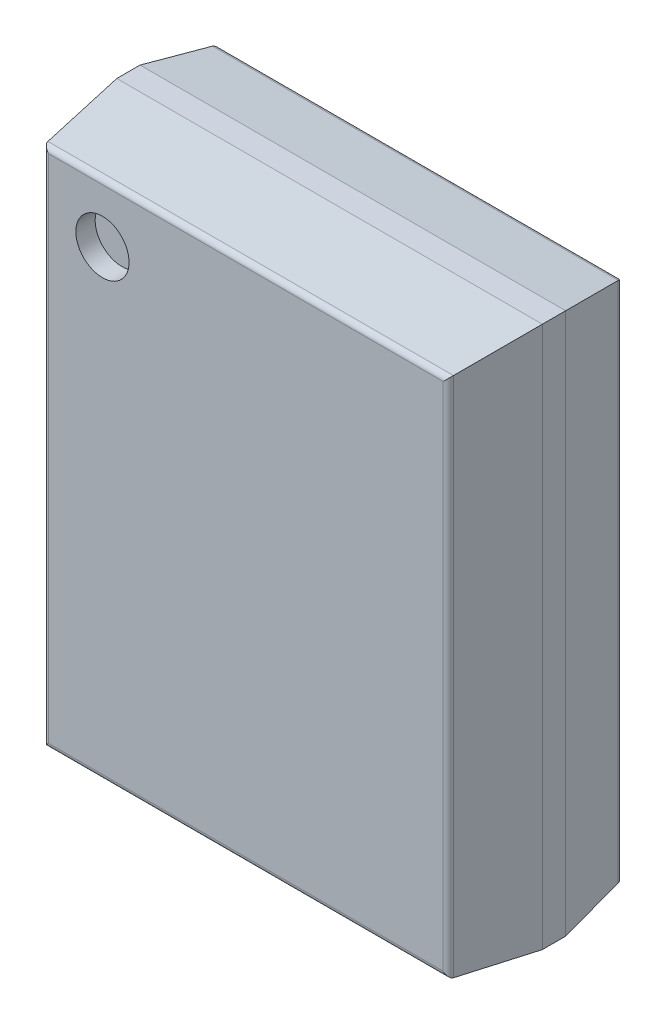
ISO-10303-21;
HEADER;
FILE_DESCRIPTION(('STEP AP214'),'2;1');
FILE_NAME('part.step','',(''),(''),'','','');
FILE_SCHEMA(('AUTOMOTIVE_DESIGN { 1 0 10303 214 1 1 1 1 }'));
ENDSEC;
DATA;
#1=APPLICATION_CONTEXT('core data for automotive mechanical design processes');
#2=APPLICATION_PROTOCOL_DEFINITION('international standard','automotive_design',2000,#1);
#3=PRODUCT_CONTEXT('',#1,'mechanical');
#4=PRODUCT('Part','Part','',(#3));
#5=PRODUCT_RELATED_PRODUCT_CATEGORY('part','',(#4));
#6=PRODUCT_DEFINITION_FORMATION('','',#4);
#7=PRODUCT_DEFINITION_CONTEXT('part definition',#1,'design');
#8=PRODUCT_DEFINITION('design','',#6,#7);
#9=PRODUCT_DEFINITION_SHAPE('','',#8);
#10=(LENGTH_UNIT() NAMED_UNIT(*) SI_UNIT(.MILLI.,.METRE.));
#11=(NAMED_UNIT(*) PLANE_ANGLE_UNIT() SI_UNIT($,.RADIAN.));
#12=(NAMED_UNIT(*) SI_UNIT($,.STERADIAN.) SOLID_ANGLE_UNIT());
#13=UNCERTAINTY_MEASURE_WITH_UNIT(LENGTH_MEASURE(1.E-05),#10,'distance_accuracy_value','');
#14=(GEOMETRIC_REPRESENTATION_CONTEXT(3) GLOBAL_UNCERTAINTY_ASSIGNED_CONTEXT((#13)) GLOBAL_UNIT_ASSIGNED_CONTEXT((#10,
#11,#12)) REPRESENTATION_CONTEXT('',''));
#15=CARTESIAN_POINT('',(0.,0.,0.));
#16=DIRECTION('',(0.,0.,1.));
#17=DIRECTION('',(1.,0.,0.));
#18=AXIS2_PLACEMENT_3D('',#15,#16,#17);
#19=CARTESIAN_POINT('',(-1.2975,1.8225,1.575));
#20=DIRECTION('',(0.,0.,1.));
#21=DIRECTION('',(1.,0.,0.));
#22=AXIS2_PLACEMENT_3D('',#19,#20,#21);
#23=PLANE('',#22);
#24=CARTESIAN_POINT('',(-1.2975,1.8225,1.575));
#25=DIRECTION('',(0.,0.,1.));
#26=DIRECTION('',(1.,0.,0.));
#27=AXIS2_PLACEMENT_3D('',#24,#25,#26);
#28=CIRCLE('',#27,0.240625);
#29=CARTESIAN_POINT('',(-1.056875,1.8225,1.575));
#30=VERTEX_POINT('',#29);
#31=EDGE_CURVE('E11',#30,#30,#28,.T.);
#32=ORIENTED_EDGE('',*,*,#31,.T.);
#33=EDGE_LOOP('',(#32));
#34=FACE_BOUND('',#33,.T.);
#35=ADVANCED_FACE('F17',(#34),#23,.T.);
#36=CARTESIAN_POINT('',(-1.2975,1.8225,1.575));
#37=DIRECTION('',(0.,0.,1.));
#38=DIRECTION('',(1.,0.,0.));
#39=AXIS2_PLACEMENT_3D('',#36,#37,#38);
#40=CYLINDRICAL_SURFACE('',#39,0.240625);
#41=DIRECTION('',(0.,0.,1.));
#42=VECTOR('',#41,1.);
#43=CARTESIAN_POINT('',(-1.056875,1.8225,1.575));
#44=LINE('',#43,#42);
#45=CARTESIAN_POINT('',(-1.056875,1.8225,1.75));
#46=VERTEX_POINT('',#45);
#47=EDGE_CURVE('E20',#30,#46,#44,.T.);
#48=ORIENTED_EDGE('',*,*,#47,.T.);
#49=CARTESIAN_POINT('',(-1.2975,1.8225,1.75));
#50=DIRECTION('',(0.,0.,1.));
#51=DIRECTION('',(1.,0.,0.));
#52=AXIS2_PLACEMENT_3D('',#49,#50,#51);
#53=CIRCLE('',#52,0.240625);
#54=EDGE_CURVE('E297',#46,#46,#53,.T.);
#55=ORIENTED_EDGE('',*,*,#54,.T.);
#56=ORIENTED_EDGE('',*,*,#47,.F.);
#57=ORIENTED_EDGE('',*,*,#31,.F.);
#58=EDGE_LOOP('',(#48,#55,#56,#57));
#59=FACE_BOUND('',#58,.T.);
#60=ADVANCED_FACE('F522',(#59),#40,.F.);
#61=CARTESIAN_POINT('',(1.78470292559,-2.35375,1.7));
#62=DIRECTION('',(0.,1.,0.));
#63=DIRECTION('',(0.,0.,1.));
#64=AXIS2_PLACEMENT_3D('',#61,#62,#63);
#65=CYLINDRICAL_SURFACE('',#64,0.05);
#66=CARTESIAN_POINT('',(1.78470292559,-2.30970292559,1.7));
#67=DIRECTION('',(-0.707106781186548,-0.707106781186548,0.));
#68=DIRECTION('',(0.707106781186548,-0.707106781186548,0.));
#69=AXIS2_PLACEMENT_3D('',#66,#67,#68);
#70=ELLIPSE('',#69,0.07071067811865,0.05);
#71=CARTESIAN_POINT('',(1.834303869648,-2.359303869648,1.706304470526));
#72=VERTEX_POINT('',#71);
#73=CARTESIAN_POINT('',(1.78470292559,-2.30970292559,1.75));
#74=VERTEX_POINT('',#73);
#75=EDGE_CURVE('E281',#72,#74,#70,.T.);
#76=ORIENTED_EDGE('',*,*,#75,.F.);
#77=DIRECTION('',(0.,1.,0.));
#78=VECTOR('',#77,1.);
#79=CARTESIAN_POINT('',(1.834303869648,-2.35375,1.706304470526));
#80=LINE('',#79,#78);
#81=CARTESIAN_POINT('',(1.834303869648,2.359303869648,1.706304470526));
#82=VERTEX_POINT('',#81);
#83=EDGE_CURVE('E277',#72,#82,#80,.T.);
#84=ORIENTED_EDGE('',*,*,#83,.T.);
#85=CARTESIAN_POINT('',(1.78470292559,2.30970292559,1.7));
#86=DIRECTION('',(-0.707106781186548,0.707106781186548,0.));
#87=DIRECTION('',(0.707106781186548,0.707106781186548,0.));
#88=AXIS2_PLACEMENT_3D('',#85,#86,#87);
#89=ELLIPSE('',#88,0.07071067811865,0.05);
#90=CARTESIAN_POINT('',(1.78470292559,2.30970292559,1.75));
#91=VERTEX_POINT('',#90);
#92=EDGE_CURVE('E299',#91,#82,#89,.T.);
#93=ORIENTED_EDGE('',*,*,#92,.F.);
#94=DIRECTION('',(0.,1.,0.));
#95=VECTOR('',#94,1.);
#96=CARTESIAN_POINT('',(1.78470292559,-2.35375,1.75));
#97=LINE('',#96,#95);
#98=EDGE_CURVE('E289',#74,#91,#97,.T.);
#99=ORIENTED_EDGE('',*,*,#98,.F.);
#100=EDGE_LOOP('',(#76,#84,#93,#99));
#101=FACE_BOUND('',#100,.T.);
#102=ADVANCED_FACE('F513',(#101),#65,.T.);
#103=CARTESIAN_POINT('',(-1.82875,2.30970292559,1.7));
#104=DIRECTION('',(1.,0.,0.));
#105=DIRECTION('',(0.,0.,1.));
#106=AXIS2_PLACEMENT_3D('',#103,#104,#105);
#107=CYLINDRICAL_SURFACE('',#106,0.05);
#108=DIRECTION('',(1.,0.,0.));
#109=VECTOR('',#108,1.);
#110=CARTESIAN_POINT('',(-1.82875,2.30970292559,1.75));
#111=LINE('',#110,#109);
#112=CARTESIAN_POINT('',(-1.78470292559,2.30970292559,1.75));
#113=VERTEX_POINT('',#112);
#114=EDGE_CURVE('E293',#113,#91,#111,.T.);
#115=ORIENTED_EDGE('',*,*,#114,.T.);
#116=ORIENTED_EDGE('',*,*,#92,.T.);
#117=DIRECTION('',(1.,0.,0.));
#118=VECTOR('',#117,1.);
#119=CARTESIAN_POINT('',(-1.82875,2.359303869648,1.706304470526));
#120=LINE('',#119,#118);
#121=CARTESIAN_POINT('',(-1.834303869648,2.359303869648,1.706304470526));
#122=VERTEX_POINT('',#121);
#123=EDGE_CURVE('E192',#122,#82,#120,.T.);
#124=ORIENTED_EDGE('',*,*,#123,.F.);
#125=CARTESIAN_POINT('',(-1.78470292559,2.30970292559,1.7));
#126=DIRECTION('',(0.707106781186548,0.707106781186548,0.));
#127=DIRECTION('',(-0.707106781186548,0.707106781186548,0.));
#128=AXIS2_PLACEMENT_3D('',#125,#126,#127);
#129=ELLIPSE('',#128,0.07071067811865,0.05);
#130=EDGE_CURVE('E271',#122,#113,#129,.T.);
#131=ORIENTED_EDGE('',*,*,#130,.T.);
#132=EDGE_LOOP('',(#115,#116,#124,#131));
#133=FACE_BOUND('',#132,.T.);
#134=ADVANCED_FACE('F503',(#133),#107,.T.);
#135=CARTESIAN_POINT('',(-1.925,-2.45,1.75));
#136=DIRECTION('',(0.,0.,1.));
#137=DIRECTION('',(1.,0.,0.));
#138=AXIS2_PLACEMENT_3D('',#135,#136,#137);
#139=PLANE('',#138);
#140=ORIENTED_EDGE('',*,*,#54,.F.);
#141=EDGE_LOOP('',(#140));
#142=FACE_BOUND('',#141,.T.);
#143=DIRECTION('',(0.,1.,0.));
#144=VECTOR('',#143,1.);
#145=CARTESIAN_POINT('',(-1.78470292559,-2.35375,1.75));
#146=LINE('',#145,#144);
#147=CARTESIAN_POINT('',(-1.78470292559,-2.30970292559,1.75));
#148=VERTEX_POINT('',#147);
#149=EDGE_CURVE('E267',#148,#113,#146,.T.);
#150=ORIENTED_EDGE('',*,*,#149,.F.);
#151=DIRECTION('',(1.,0.,0.));
#152=VECTOR('',#151,1.);
#153=CARTESIAN_POINT('',(-1.82875,-2.30970292559,1.75));
#154=LINE('',#153,#152);
#155=EDGE_CURVE('E285',#148,#74,#154,.T.);
#156=ORIENTED_EDGE('',*,*,#155,.T.);
#157=ORIENTED_EDGE('',*,*,#98,.T.);
#158=ORIENTED_EDGE('',*,*,#114,.F.);
#159=EDGE_LOOP('',(#150,#156,#157,#158));
#160=FACE_BOUND('',#159,.T.);
#161=ADVANCED_FACE('F493',(#142,#160),#139,.T.);
#162=CARTESIAN_POINT('',(-1.82875,-2.30970292559,1.7));
#163=DIRECTION('',(1.,0.,0.));
#164=DIRECTION('',(0.,-0.992018881147276,0.126089410528035));
#165=AXIS2_PLACEMENT_3D('',#162,#163,#164);
#166=CYLINDRICAL_SURFACE('',#165,0.05);
#167=DIRECTION('',(1.,0.,0.));
#168=VECTOR('',#167,1.);
#169=CARTESIAN_POINT('',(-1.82875,-2.359303869648,1.706304470526));
#170=LINE('',#169,#168);
#171=CARTESIAN_POINT('',(-1.834303869648,-2.359303869648,1.706304470526));
#172=VERTEX_POINT('',#171);
#173=EDGE_CURVE('E216',#172,#72,#170,.T.);
#174=ORIENTED_EDGE('',*,*,#173,.T.);
#175=ORIENTED_EDGE('',*,*,#75,.T.);
#176=ORIENTED_EDGE('',*,*,#155,.F.);
#177=CARTESIAN_POINT('',(-1.78470292559,-2.30970292559,1.7));
#178=DIRECTION('',(-0.707106781186548,0.707106781186548,0.));
#179=DIRECTION('',(0.707106781186548,0.707106781186548,0.));
#180=AXIS2_PLACEMENT_3D('',#177,#178,#179);
#181=ELLIPSE('',#180,0.07071067811865,0.05);
#182=EDGE_CURVE('E220',#172,#148,#181,.T.);
#183=ORIENTED_EDGE('',*,*,#182,.F.);
#184=EDGE_LOOP('',(#174,#175,#176,#183));
#185=FACE_BOUND('',#184,.T.);
#186=ADVANCED_FACE('F484',(#185),#166,.T.);
#187=CARTESIAN_POINT('',(1.876875,-2.45,1.37137257637));
#188=DIRECTION('',(0.992018881147276,0.,0.126089410528035));
#189=DIRECTION('',(0.,-1.,0.));
#190=AXIS2_PLACEMENT_3D('',#187,#188,#189);
#191=PLANE('',#190);
#192=DIRECTION('',(-0.125098887175002,0.125098887175002,0.984225856628016));
#193=VECTOR('',#192,1.);
#194=CARTESIAN_POINT('',(1.847502410055,-2.372502410055,1.602463860656));
#195=LINE('',#194,#193);
#196=CARTESIAN_POINT('',(1.925,-2.45,0.992745152739));
#197=VERTEX_POINT('',#196);
#198=EDGE_CURVE('E221',#197,#72,#195,.T.);
#199=ORIENTED_EDGE('',*,*,#198,.F.);
#200=DIRECTION('',(0.,1.,0.));
#201=VECTOR('',#200,1.);
#202=CARTESIAN_POINT('',(1.925,-2.45,0.992745152739));
#203=LINE('',#202,#201);
#204=CARTESIAN_POINT('',(1.925,2.45,0.992745152739));
#205=VERTEX_POINT('',#204);
#206=EDGE_CURVE('E154',#197,#205,#203,.T.);
#207=ORIENTED_EDGE('',*,*,#206,.T.);
#208=DIRECTION('',(-0.125098887175002,-0.125098887175002,0.984225856628016));
#209=VECTOR('',#208,1.);
#210=CARTESIAN_POINT('',(1.809160567702,2.334160567702,1.90412148117));
#211=LINE('',#210,#209);
#212=EDGE_CURVE('E148',#205,#82,#211,.T.);
#213=ORIENTED_EDGE('',*,*,#212,.T.);
#214=ORIENTED_EDGE('',*,*,#83,.F.);
#215=EDGE_LOOP('',(#199,#207,#213,#214));
#216=FACE_BOUND('',#215,.T.);
#217=ADVANCED_FACE('F475',(#216),#191,.T.);
#218=CARTESIAN_POINT('',(-1.925,2.401875,1.37137257637));
#219=DIRECTION('',(0.,0.992018881147276,0.126089410528035));
#220=DIRECTION('',(1.,0.,0.));
#221=AXIS2_PLACEMENT_3D('',#218,#219,#220);
#222=PLANE('',#221);
#223=ORIENTED_EDGE('',*,*,#123,.T.);
#224=ORIENTED_EDGE('',*,*,#212,.F.);
#225=DIRECTION('',(1.,0.,0.));
#226=VECTOR('',#225,1.);
#227=CARTESIAN_POINT('',(-1.925,2.45,0.992745152739));
#228=LINE('',#227,#226);
#229=CARTESIAN_POINT('',(-1.925,2.45,0.992745152739));
#230=VERTEX_POINT('',#229);
#231=EDGE_CURVE('E141',#230,#205,#228,.T.);
#232=ORIENTED_EDGE('',*,*,#231,.F.);
#233=DIRECTION('',(0.125098887175002,-0.125098887175002,0.984225856628016));
#234=VECTOR('',#233,1.);
#235=CARTESIAN_POINT('',(-1.839286300979,2.364286300979,1.667104779337));
#236=LINE('',#235,#234);
#237=EDGE_CURVE('E145',#230,#122,#236,.T.);
#238=ORIENTED_EDGE('',*,*,#237,.T.);
#239=EDGE_LOOP('',(#223,#224,#232,#238));
#240=FACE_BOUND('',#239,.T.);
#241=ADVANCED_FACE('F144',(#240),#222,.T.);
#242=CARTESIAN_POINT('',(-1.78470292559,-2.35375,1.7));
#243=DIRECTION('',(0.,1.,0.));
#244=DIRECTION('',(-0.992018881147276,0.,0.126089410528035));
#245=AXIS2_PLACEMENT_3D('',#242,#243,#244);
#246=CYLINDRICAL_SURFACE('',#245,0.05);
#247=ORIENTED_EDGE('',*,*,#182,.T.);
#248=ORIENTED_EDGE('',*,*,#149,.T.);
#249=ORIENTED_EDGE('',*,*,#130,.F.);
#250=DIRECTION('',(0.,1.,0.));
#251=VECTOR('',#250,1.);
#252=CARTESIAN_POINT('',(-1.834303869648,-2.35375,1.706304470526));
#253=LINE('',#252,#251);
#254=EDGE_CURVE('E164',#172,#122,#253,.T.);
#255=ORIENTED_EDGE('',*,*,#254,.F.);
#256=EDGE_LOOP('',(#247,#248,#249,#255));
#257=FACE_BOUND('',#256,.T.);
#258=ADVANCED_FACE('F458',(#257),#246,.T.);
#259=CARTESIAN_POINT('',(-1.925,-2.401875,1.37137257637));
#260=DIRECTION('',(0.,0.992018881147276,-0.126089410528035));
#261=DIRECTION('',(-1.,0.,0.));
#262=AXIS2_PLACEMENT_3D('',#259,#260,#261);
#263=PLANE('',#262);
#264=DIRECTION('',(0.125098887175002,0.125098887175002,0.984225856628016));
#265=VECTOR('',#264,1.);
#266=CARTESIAN_POINT('',(-1.877628143332,-2.402628143332,1.365447158824));
#267=LINE('',#266,#265);
#268=CARTESIAN_POINT('',(-1.925,-2.45,0.992745152739));
#269=VERTEX_POINT('',#268);
#270=EDGE_CURVE('E166',#269,#172,#267,.T.);
#271=ORIENTED_EDGE('',*,*,#270,.F.);
#272=DIRECTION('',(1.,0.,0.));
#273=VECTOR('',#272,1.);
#274=CARTESIAN_POINT('',(-1.925,-2.45,0.992745152739));
#275=LINE('',#274,#273);
#276=EDGE_CURVE('E240',#269,#197,#275,.T.);
#277=ORIENTED_EDGE('',*,*,#276,.T.);
#278=ORIENTED_EDGE('',*,*,#198,.T.);
#279=ORIENTED_EDGE('',*,*,#173,.F.);
#280=EDGE_LOOP('',(#271,#277,#278,#279));
#281=FACE_BOUND('',#280,.T.);
#282=ADVANCED_FACE('F448',(#281),#263,.F.);
#283=CARTESIAN_POINT('',(1.925,-2.45,0.175));
#284=DIRECTION('',(1.,0.,0.));
#285=DIRECTION('',(0.,1.,0.));
#286=AXIS2_PLACEMENT_3D('',#283,#284,#285);
#287=PLANE('',#286);
#288=DIRECTION('',(0.,0.,1.));
#289=VECTOR('',#288,1.);
#290=CARTESIAN_POINT('',(1.925,-2.45,0.175));
#291=LINE('',#290,#289);
#292=CARTESIAN_POINT('',(1.925,-2.45,0.782745152739));
#293=VERTEX_POINT('',#292);
#294=EDGE_CURVE('E232',#293,#197,#291,.T.);
#295=ORIENTED_EDGE('',*,*,#294,.F.);
#296=DIRECTION('',(0.,1.,0.));
#297=VECTOR('',#296,1.);
#298=CARTESIAN_POINT('',(1.925,-2.45,0.782745152739));
#299=LINE('',#298,#297);
#300=CARTESIAN_POINT('',(1.925,2.45,0.782745152739));
#301=VERTEX_POINT('',#300);
#302=EDGE_CURVE('E231',#293,#301,#299,.T.);
#303=ORIENTED_EDGE('',*,*,#302,.T.);
#304=DIRECTION('',(0.,0.,1.));
#305=VECTOR('',#304,1.);
#306=CARTESIAN_POINT('',(1.925,2.45,0.175));
#307=LINE('',#306,#305);
#308=EDGE_CURVE('E155',#301,#205,#307,.T.);
#309=ORIENTED_EDGE('',*,*,#308,.T.);
#310=ORIENTED_EDGE('',*,*,#206,.F.);
#311=EDGE_LOOP('',(#295,#303,#309,#310));
#312=FACE_BOUND('',#311,.T.);
#313=ADVANCED_FACE('F438',(#312),#287,.T.);
#314=CARTESIAN_POINT('',(1.786045453828,-2.35375,0.225));
#315=DIRECTION('',(0.,1.,0.));
#316=DIRECTION('',(0.,0.,-1.));
#317=AXIS2_PLACEMENT_3D('',#314,#315,#316);
#318=CYLINDRICAL_SURFACE('',#317,0.05);
#319=DIRECTION('',(0.,1.,0.));
#320=VECTOR('',#319,1.);
#321=CARTESIAN_POINT('',(1.786045453828,-2.35375,0.175));
#322=LINE('',#321,#320);
#323=CARTESIAN_POINT('',(1.786045453828,-2.311045453828,0.175));
#324=VERTEX_POINT('',#323);
#325=CARTESIAN_POINT('',(1.786045453828,2.311045453828,0.175));
#326=VERTEX_POINT('',#325);
#327=EDGE_CURVE('E251',#324,#326,#322,.T.);
#328=ORIENTED_EDGE('',*,*,#327,.T.);
#329=CARTESIAN_POINT('',(1.786045453828,2.311045453828,0.225));
#330=DIRECTION('',(0.707106781186548,-0.707106781186548,0.));
#331=DIRECTION('',(0.707106781186548,0.707106781186548,0.));
#332=AXIS2_PLACEMENT_3D('',#329,#330,#331);
#333=ELLIPSE('',#332,0.07071067811865,0.05);
#334=CARTESIAN_POINT('',(1.83542996346,2.36042996346,0.217178861435));
#335=VERTEX_POINT('',#334);
#336=EDGE_CURVE('E255',#326,#335,#333,.T.);
#337=ORIENTED_EDGE('',*,*,#336,.T.);
#338=DIRECTION('',(0.,1.,0.));
#339=VECTOR('',#338,1.);
#340=CARTESIAN_POINT('',(1.83542996346,-2.35375,0.217178861435));
#341=LINE('',#340,#339);
#342=CARTESIAN_POINT('',(1.83542996346,-2.36042996346,0.217178861435));
#343=VERTEX_POINT('',#342);
#344=EDGE_CURVE('E227',#343,#335,#341,.T.);
#345=ORIENTED_EDGE('',*,*,#344,.F.);
#346=CARTESIAN_POINT('',(1.786045453828,-2.311045453828,0.225));
#347=DIRECTION('',(0.707106781186548,0.707106781186548,0.));
#348=DIRECTION('',(0.707106781186548,-0.707106781186548,0.));
#349=AXIS2_PLACEMENT_3D('',#346,#347,#348);
#350=ELLIPSE('',#349,0.07071067811865,0.05);
#351=EDGE_CURVE('E236',#343,#324,#350,.T.);
#352=ORIENTED_EDGE('',*,*,#351,.T.);
#353=EDGE_LOOP('',(#328,#337,#345,#352));
#354=FACE_BOUND('',#353,.T.);
#355=ADVANCED_FACE('F429',(#354),#318,.T.);
#356=CARTESIAN_POINT('',(-1.925,2.45,0.175));
#357=DIRECTION('',(0.,1.,0.));
#358=DIRECTION('',(1.,0.,0.));
#359=AXIS2_PLACEMENT_3D('',#356,#357,#358);
#360=PLANE('',#359);
#361=ORIENTED_EDGE('',*,*,#308,.F.);
#362=DIRECTION('',(1.,0.,0.));
#363=VECTOR('',#362,1.);
#364=CARTESIAN_POINT('',(-1.925,2.45,0.782745152739));
#365=LINE('',#364,#363);
#366=CARTESIAN_POINT('',(-1.925,2.45,0.782745152739));
#367=VERTEX_POINT('',#366);
#368=EDGE_CURVE('E172',#367,#301,#365,.T.);
#369=ORIENTED_EDGE('',*,*,#368,.F.);
#370=DIRECTION('',(0.,0.,1.));
#371=VECTOR('',#370,1.);
#372=CARTESIAN_POINT('',(-1.925,2.45,0.175));
#373=LINE('',#372,#371);
#374=EDGE_CURVE('E169',#367,#230,#373,.T.);
#375=ORIENTED_EDGE('',*,*,#374,.T.);
#376=ORIENTED_EDGE('',*,*,#231,.T.);
#377=EDGE_LOOP('',(#361,#369,#375,#376));
#378=FACE_BOUND('',#377,.T.);
#379=ADVANCED_FACE('F170',(#378),#360,.T.);
#380=CARTESIAN_POINT('',(-1.876875,-2.45,1.37137257637));
#381=DIRECTION('',(0.992018881147276,0.,-0.126089410528035));
#382=DIRECTION('',(0.,-1.,0.));
#383=AXIS2_PLACEMENT_3D('',#380,#381,#382);
#384=PLANE('',#383);
#385=ORIENTED_EDGE('',*,*,#254,.T.);
#386=ORIENTED_EDGE('',*,*,#237,.F.);
#387=DIRECTION('',(0.,1.,0.));
#388=VECTOR('',#387,1.);
#389=CARTESIAN_POINT('',(-1.925,-2.45,0.992745152739));
#390=LINE('',#389,#388);
#391=EDGE_CURVE('E162',#269,#230,#390,.T.);
#392=ORIENTED_EDGE('',*,*,#391,.F.);
#393=ORIENTED_EDGE('',*,*,#270,.T.);
#394=EDGE_LOOP('',(#385,#386,#392,#393));
#395=FACE_BOUND('',#394,.T.);
#396=ADVANCED_FACE('F159',(#395),#384,.F.);
#397=CARTESIAN_POINT('',(-1.82875,2.311045453828,0.225));
#398=DIRECTION('',(1.,0.,0.));
#399=DIRECTION('',(0.,0.,-1.));
#400=AXIS2_PLACEMENT_3D('',#397,#398,#399);
#401=CYLINDRICAL_SURFACE('',#400,0.05);
#402=CARTESIAN_POINT('',(-1.786045453828,2.311045453828,0.225));
#403=DIRECTION('',(-0.707106781186548,-0.707106781186548,0.));
#404=DIRECTION('',(-0.707106781186548,0.707106781186548,0.));
#405=AXIS2_PLACEMENT_3D('',#402,#403,#404);
#406=ELLIPSE('',#405,0.07071067811865,0.05);
#407=CARTESIAN_POINT('',(-1.83542996346,2.36042996346,0.217178861435));
#408=VERTEX_POINT('',#407);
#409=CARTESIAN_POINT('',(-1.786045453828,2.311045453828,0.175));
#410=VERTEX_POINT('',#409);
#411=EDGE_CURVE('E207',#408,#410,#406,.T.);
#412=ORIENTED_EDGE('',*,*,#411,.F.);
#413=DIRECTION('',(1.,0.,0.));
#414=VECTOR('',#413,1.);
#415=CARTESIAN_POINT('',(-1.82875,2.36042996346,0.217178861435));
#416=LINE('',#415,#414);
#417=EDGE_CURVE('E211',#408,#335,#416,.T.);
#418=ORIENTED_EDGE('',*,*,#417,.T.);
#419=ORIENTED_EDGE('',*,*,#336,.F.);
#420=DIRECTION('',(1.,0.,0.));
#421=VECTOR('',#420,1.);
#422=CARTESIAN_POINT('',(-1.82875,2.311045453828,0.175));
#423=LINE('',#422,#421);
#424=EDGE_CURVE('E247',#410,#326,#423,.T.);
#425=ORIENTED_EDGE('',*,*,#424,.F.);
#426=EDGE_LOOP('',(#412,#418,#419,#425));
#427=FACE_BOUND('',#426,.T.);
#428=ADVANCED_FACE('F403',(#427),#401,.T.);
#429=CARTESIAN_POINT('',(-1.925,-2.45,0.175));
#430=DIRECTION('',(0.,0.,1.));
#431=DIRECTION('',(1.,0.,0.));
#432=AXIS2_PLACEMENT_3D('',#429,#430,#431);
#433=PLANE('',#432);
#434=ORIENTED_EDGE('',*,*,#424,.T.);
#435=ORIENTED_EDGE('',*,*,#327,.F.);
#436=DIRECTION('',(1.,0.,0.));
#437=VECTOR('',#436,1.);
#438=CARTESIAN_POINT('',(-1.82875,-2.311045453828,0.175));
#439=LINE('',#438,#437);
#440=CARTESIAN_POINT('',(-1.786045453828,-2.311045453828,0.175));
#441=VERTEX_POINT('',#440);
#442=EDGE_CURVE('E214',#441,#324,#439,.T.);
#443=ORIENTED_EDGE('',*,*,#442,.F.);
#444=DIRECTION('',(0.,1.,0.));
#445=VECTOR('',#444,1.);
#446=CARTESIAN_POINT('',(-1.786045453828,-2.35375,0.175));
#447=LINE('',#446,#445);
#448=EDGE_CURVE('E189',#441,#410,#447,.T.);
#449=ORIENTED_EDGE('',*,*,#448,.T.);
#450=EDGE_LOOP('',(#434,#435,#443,#449));
#451=FACE_BOUND('',#450,.T.);
#452=ADVANCED_FACE('F394',(#451),#433,.F.);
#453=CARTESIAN_POINT('',(1.876875,-2.45,0.47887257637));
#454=DIRECTION('',(-0.987690192629402,0.,0.156422771308064));
#455=DIRECTION('',(0.,1.,0.));
#456=AXIS2_PLACEMENT_3D('',#453,#454,#455);
#457=PLANE('',#456);
#458=ORIENTED_EDGE('',*,*,#344,.T.);
#459=DIRECTION('',(-0.154543505653012,-0.154543505653012,-0.975824066992076));
#460=VECTOR('',#459,1.);
#461=CARTESIAN_POINT('',(1.773533236593,2.298533236593,-0.17365163959));
#462=LINE('',#461,#460);
#463=EDGE_CURVE('E203',#301,#335,#462,.T.);
#464=ORIENTED_EDGE('',*,*,#463,.F.);
#465=ORIENTED_EDGE('',*,*,#302,.F.);
#466=DIRECTION('',(-0.154543505653012,0.154543505653012,-0.975824066992076));
#467=VECTOR('',#466,1.);
#468=CARTESIAN_POINT('',(1.832048289685,-2.357048289685,0.195826177334));
#469=LINE('',#468,#467);
#470=EDGE_CURVE('E195',#293,#343,#469,.T.);
#471=ORIENTED_EDGE('',*,*,#470,.T.);
#472=EDGE_LOOP('',(#458,#464,#465,#471));
#473=FACE_BOUND('',#472,.T.);
#474=ADVANCED_FACE('F384',(#473),#457,.F.);
#475=CARTESIAN_POINT('',(-1.925,-2.45,0.175));
#476=DIRECTION('',(0.,1.,0.));
#477=DIRECTION('',(1.,0.,0.));
#478=AXIS2_PLACEMENT_3D('',#475,#476,#477);
#479=PLANE('',#478);
#480=ORIENTED_EDGE('',*,*,#276,.F.);
#481=DIRECTION('',(0.,0.,1.));
#482=VECTOR('',#481,1.);
#483=CARTESIAN_POINT('',(-1.925,-2.45,0.175));
#484=LINE('',#483,#482);
#485=CARTESIAN_POINT('',(-1.925,-2.45,0.782745152739));
#486=VERTEX_POINT('',#485);
#487=EDGE_CURVE('E177',#486,#269,#484,.T.);
#488=ORIENTED_EDGE('',*,*,#487,.F.);
#489=DIRECTION('',(1.,0.,0.));
#490=VECTOR('',#489,1.);
#491=CARTESIAN_POINT('',(-1.925,-2.45,0.782745152739));
#492=LINE('',#491,#490);
#493=EDGE_CURVE('E199',#486,#293,#492,.T.);
#494=ORIENTED_EDGE('',*,*,#493,.T.);
#495=ORIENTED_EDGE('',*,*,#294,.T.);
#496=EDGE_LOOP('',(#480,#488,#494,#495));
#497=FACE_BOUND('',#496,.T.);
#498=ADVANCED_FACE('F373',(#497),#479,.F.);
#499=CARTESIAN_POINT('',(-1.82875,-2.311045453828,0.225));
#500=DIRECTION('',(1.,0.,0.));
#501=DIRECTION('',(0.,-0.987690192629402,-0.156422771308064));
#502=AXIS2_PLACEMENT_3D('',#499,#500,#501);
#503=CYLINDRICAL_SURFACE('',#502,0.05);
#504=CARTESIAN_POINT('',(-1.786045453828,-2.311045453828,0.225));
#505=DIRECTION('',(0.707106781186548,-0.707106781186548,0.));
#506=DIRECTION('',(0.707106781186548,0.707106781186548,0.));
#507=AXIS2_PLACEMENT_3D('',#504,#505,#506);
#508=ELLIPSE('',#507,0.07071067811865,0.05);
#509=CARTESIAN_POINT('',(-1.83542996346,-2.36042996346,0.217178861435));
#510=VERTEX_POINT('',#509);
#511=EDGE_CURVE('E182',#510,#441,#508,.T.);
#512=ORIENTED_EDGE('',*,*,#511,.T.);
#513=ORIENTED_EDGE('',*,*,#442,.T.);
#514=ORIENTED_EDGE('',*,*,#351,.F.);
#515=DIRECTION('',(1.,0.,0.));
#516=VECTOR('',#515,1.);
#517=CARTESIAN_POINT('',(-1.82875,-2.36042996346,0.217178861435));
#518=LINE('',#517,#516);
#519=EDGE_CURVE('E200',#510,#343,#518,.T.);
#520=ORIENTED_EDGE('',*,*,#519,.F.);
#521=EDGE_LOOP('',(#512,#513,#514,#520));
#522=FACE_BOUND('',#521,.T.);
#523=ADVANCED_FACE('F363',(#522),#503,.T.);
#524=CARTESIAN_POINT('',(-1.925,2.401875,0.47887257637));
#525=DIRECTION('',(0.,-0.987690192629402,0.156422771308064));
#526=DIRECTION('',(-1.,0.,0.));
#527=AXIS2_PLACEMENT_3D('',#524,#525,#526);
#528=PLANE('',#527);
#529=DIRECTION('',(0.154543505653012,-0.154543505653012,-0.975824066992076));
#530=VECTOR('',#529,1.);
#531=CARTESIAN_POINT('',(-1.819509349737,2.344509349737,0.116652359422));
#532=LINE('',#531,#530);
#533=EDGE_CURVE('E621',#367,#408,#532,.T.);
#534=ORIENTED_EDGE('',*,*,#533,.F.);
#535=ORIENTED_EDGE('',*,*,#368,.T.);
#536=ORIENTED_EDGE('',*,*,#463,.T.);
#537=ORIENTED_EDGE('',*,*,#417,.F.);
#538=EDGE_LOOP('',(#534,#535,#536,#537));
#539=FACE_BOUND('',#538,.T.);
#540=ADVANCED_FACE('F354',(#539),#528,.F.);
#541=CARTESIAN_POINT('',(-1.925,-2.45,0.175));
#542=DIRECTION('',(1.,0.,0.));
#543=DIRECTION('',(0.,1.,0.));
#544=AXIS2_PLACEMENT_3D('',#541,#542,#543);
#545=PLANE('',#544);
#546=ORIENTED_EDGE('',*,*,#391,.T.);
#547=ORIENTED_EDGE('',*,*,#374,.F.);
#548=DIRECTION('',(0.,1.,0.));
#549=VECTOR('',#548,1.);
#550=CARTESIAN_POINT('',(-1.925,-2.45,0.782745152739));
#551=LINE('',#550,#549);
#552=EDGE_CURVE('E613',#486,#367,#551,.T.);
#553=ORIENTED_EDGE('',*,*,#552,.F.);
#554=ORIENTED_EDGE('',*,*,#487,.T.);
#555=EDGE_LOOP('',(#546,#547,#553,#554));
#556=FACE_BOUND('',#555,.T.);
#557=ADVANCED_FACE('F180',(#556),#545,.F.);
#558=CARTESIAN_POINT('',(-1.786045453828,-2.35375,0.225));
#559=DIRECTION('',(0.,1.,0.));
#560=DIRECTION('',(-0.987690192629402,0.,-0.156422771308064));
#561=AXIS2_PLACEMENT_3D('',#558,#559,#560);
#562=CYLINDRICAL_SURFACE('',#561,0.05);
#563=DIRECTION('',(0.,1.,0.));
#564=VECTOR('',#563,1.);
#565=CARTESIAN_POINT('',(-1.83542996346,-2.35375,0.217178861435));
#566=LINE('',#565,#564);
#567=EDGE_CURVE('E617',#510,#408,#566,.T.);
#568=ORIENTED_EDGE('',*,*,#567,.T.);
#569=ORIENTED_EDGE('',*,*,#411,.T.);
#570=ORIENTED_EDGE('',*,*,#448,.F.);
#571=ORIENTED_EDGE('',*,*,#511,.F.);
#572=EDGE_LOOP('',(#568,#569,#570,#571));
#573=FACE_BOUND('',#572,.T.);
#574=ADVANCED_FACE('F333',(#573),#562,.T.);
#575=CARTESIAN_POINT('',(-1.925,-2.401875,0.47887257637));
#576=DIRECTION('',(0.,-0.987690192629402,-0.156422771308064));
#577=DIRECTION('',(0.,0.156422771308064,-0.987690192629402));
#578=AXIS2_PLACEMENT_3D('',#575,#576,#577);
#579=PLANE('',#578);
#580=ORIENTED_EDGE('',*,*,#519,.T.);
#581=ORIENTED_EDGE('',*,*,#470,.F.);
#582=ORIENTED_EDGE('',*,*,#493,.F.);
#583=DIRECTION('',(0.154543505653012,0.154543505653012,-0.975824066992076));
#584=VECTOR('',#583,1.);
#585=CARTESIAN_POINT('',(-1.878024402829,-2.403024402829,0.486130176345));
#586=LINE('',#585,#584);
#587=EDGE_CURVE('E609',#486,#510,#586,.T.);
#588=ORIENTED_EDGE('',*,*,#587,.T.);
#589=EDGE_LOOP('',(#580,#581,#582,#588));
#590=FACE_BOUND('',#589,.T.);
#591=ADVANCED_FACE('F321',(#590),#579,.T.);
#592=CARTESIAN_POINT('',(-1.876875,-2.45,0.47887257637));
#593=DIRECTION('',(-0.987690192629402,0.,-0.156422771308064));
#594=DIRECTION('',(-0.156422771308064,0.,0.987690192629402));
#595=AXIS2_PLACEMENT_3D('',#592,#593,#594);
#596=PLANE('',#595);
#597=ORIENTED_EDGE('',*,*,#587,.F.);
#598=ORIENTED_EDGE('',*,*,#552,.T.);
#599=ORIENTED_EDGE('',*,*,#533,.T.);
#600=ORIENTED_EDGE('',*,*,#567,.F.);
#601=EDGE_LOOP('',(#597,#598,#599,#600));
#602=FACE_BOUND('',#601,.T.);
#603=ADVANCED_FACE('F315',(#602),#596,.T.);
#604=CLOSED_SHELL('',(#35,#60,#102,#134,#161,#186,#217,#241,#258,#282,#313,#355,#379,#396,#428,
#452,#474,#498,#523,#540,#557,#574,#591,#603));
#605=MANIFOLD_SOLID_BREP('B1',#604);
#606=ADVANCED_BREP_SHAPE_REPRESENTATION('',(#18,#605),#14);
#607=SHAPE_DEFINITION_REPRESENTATION(#9,#606);
ENDSEC;
END-ISO-10303-21;
